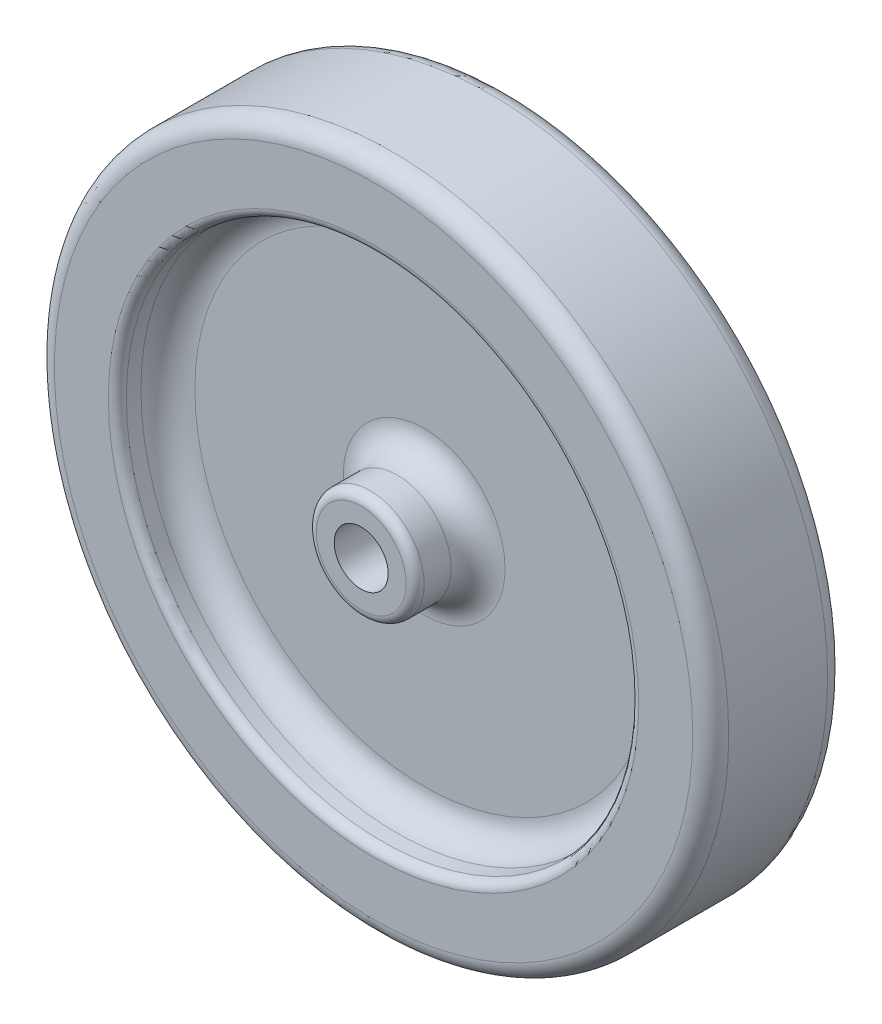
ISO-10303-21;
HEADER;
FILE_DESCRIPTION(('STEP AP214'),'2;1');
FILE_NAME('part.step','',(''),(''),'','','');
FILE_SCHEMA(('AUTOMOTIVE_DESIGN { 1 0 10303 214 1 1 1 1 }'));
ENDSEC;
DATA;
#1=APPLICATION_CONTEXT('core data for automotive mechanical design processes');
#2=APPLICATION_PROTOCOL_DEFINITION('international standard','automotive_design',2000,#1);
#3=PRODUCT_CONTEXT('',#1,'mechanical');
#4=PRODUCT('Part','Part','',(#3));
#5=PRODUCT_RELATED_PRODUCT_CATEGORY('part','',(#4));
#6=PRODUCT_DEFINITION_FORMATION('','',#4);
#7=PRODUCT_DEFINITION_CONTEXT('part definition',#1,'design');
#8=PRODUCT_DEFINITION('design','',#6,#7);
#9=PRODUCT_DEFINITION_SHAPE('','',#8);
#10=(LENGTH_UNIT() NAMED_UNIT(*) SI_UNIT(.MILLI.,.METRE.));
#11=(NAMED_UNIT(*) PLANE_ANGLE_UNIT() SI_UNIT($,.RADIAN.));
#12=(NAMED_UNIT(*) SI_UNIT($,.STERADIAN.) SOLID_ANGLE_UNIT());
#13=UNCERTAINTY_MEASURE_WITH_UNIT(LENGTH_MEASURE(1.E-05),#10,'distance_accuracy_value','');
#14=(GEOMETRIC_REPRESENTATION_CONTEXT(3) GLOBAL_UNCERTAINTY_ASSIGNED_CONTEXT((#13)) GLOBAL_UNIT_ASSIGNED_CONTEXT((#10,
#11,#12)) REPRESENTATION_CONTEXT('',''));
#15=CARTESIAN_POINT('',(0.,0.,0.));
#16=DIRECTION('',(0.,0.,1.));
#17=DIRECTION('',(1.,0.,0.));
#18=AXIS2_PLACEMENT_3D('',#15,#16,#17);
#19=CARTESIAN_POINT('',(0.,0.,10.));
#20=DIRECTION('',(0.,0.,1.));
#21=DIRECTION('',(1.,0.,0.));
#22=AXIS2_PLACEMENT_3D('',#19,#20,#21);
#23=CYLINDRICAL_SURFACE('',#22,6.);
#24=CARTESIAN_POINT('',(0.,0.,17.75));
#25=DIRECTION('',(0.,0.,1.));
#26=DIRECTION('',(1.,0.,0.));
#27=AXIS2_PLACEMENT_3D('',#24,#25,#26);
#28=CIRCLE('',#27,6.);
#29=CARTESIAN_POINT('',(6.,0.,17.75));
#30=VERTEX_POINT('',#29);
#31=EDGE_CURVE('E86',#30,#30,#28,.T.);
#32=ORIENTED_EDGE('',*,*,#31,.T.);
#33=EDGE_LOOP('',(#32));
#34=FACE_BOUND('',#33,.T.);
#35=CARTESIAN_POINT('',(0.,0.,-17.75));
#36=DIRECTION('',(0.,0.,1.));
#37=DIRECTION('',(1.,0.,0.));
#38=AXIS2_PLACEMENT_3D('',#35,#36,#37);
#39=CIRCLE('',#38,6.);
#40=CARTESIAN_POINT('',(6.,0.,-17.75));
#41=VERTEX_POINT('',#40);
#42=EDGE_CURVE('E83',#41,#41,#39,.T.);
#43=ORIENTED_EDGE('',*,*,#42,.F.);
#44=EDGE_LOOP('',(#43));
#45=FACE_BOUND('',#44,.T.);
#46=ADVANCED_FACE('F15',(#34,#45),#23,.F.);
#47=CARTESIAN_POINT('',(0.,-6.,17.75));
#48=DIRECTION('',(0.,0.,1.));
#49=DIRECTION('',(1.,0.,0.));
#50=AXIS2_PLACEMENT_3D('',#47,#48,#49);
#51=PLANE('',#50);
#52=CARTESIAN_POINT('',(0.,0.,17.75));
#53=DIRECTION('',(0.,0.,1.));
#54=DIRECTION('',(1.,0.,0.));
#55=AXIS2_PLACEMENT_3D('',#52,#53,#54);
#56=CIRCLE('',#55,10.0000003039249);
#57=CARTESIAN_POINT('',(10.0000003039249,0.,17.75));
#58=VERTEX_POINT('',#57);
#59=EDGE_CURVE('E80',#58,#58,#56,.T.);
#60=ORIENTED_EDGE('',*,*,#59,.T.);
#61=EDGE_LOOP('',(#60));
#62=FACE_BOUND('',#61,.T.);
#63=ORIENTED_EDGE('',*,*,#31,.F.);
#64=EDGE_LOOP('',(#63));
#65=FACE_BOUND('',#64,.T.);
#66=ADVANCED_FACE('F92',(#62,#65),#51,.T.);
#67=CARTESIAN_POINT('',(0.,-10.,-17.75));
#68=DIRECTION('',(0.,0.,-1.));
#69=DIRECTION('',(-1.,0.,0.));
#70=AXIS2_PLACEMENT_3D('',#67,#68,#69);
#71=PLANE('',#70);
#72=ORIENTED_EDGE('',*,*,#42,.T.);
#73=EDGE_LOOP('',(#72));
#74=FACE_BOUND('',#73,.T.);
#75=CARTESIAN_POINT('',(0.,0.,-17.75));
#76=DIRECTION('',(0.,0.,1.));
#77=DIRECTION('',(1.,0.,0.));
#78=AXIS2_PLACEMENT_3D('',#75,#76,#77);
#79=CIRCLE('',#78,10.0000003345299);
#80=CARTESIAN_POINT('',(10.0000003345299,0.,-17.75));
#81=VERTEX_POINT('',#80);
#82=EDGE_CURVE('E77',#81,#81,#79,.T.);
#83=ORIENTED_EDGE('',*,*,#82,.F.);
#84=EDGE_LOOP('',(#83));
#85=FACE_BOUND('',#84,.T.);
#86=ADVANCED_FACE('F94',(#74,#85),#71,.T.);
#87=CARTESIAN_POINT('',(0.,0.,15.7499999999997));
#88=DIRECTION('',(0.,0.,1.));
#89=DIRECTION('',(1.,0.,0.));
#90=AXIS2_PLACEMENT_3D('',#87,#88,#89);
#91=TOROIDAL_SURFACE('',#90,9.99999999999967,2.00000000000033);
#92=CARTESIAN_POINT('',(0.,0.,15.75));
#93=DIRECTION('',(0.,0.,1.));
#94=DIRECTION('',(1.,0.,0.));
#95=AXIS2_PLACEMENT_3D('',#92,#93,#94);
#96=CIRCLE('',#95,12.);
#97=CARTESIAN_POINT('',(12.,0.,15.75));
#98=VERTEX_POINT('',#97);
#99=EDGE_CURVE('E74',#98,#98,#96,.T.);
#100=ORIENTED_EDGE('',*,*,#99,.T.);
#101=EDGE_LOOP('',(#100));
#102=FACE_BOUND('',#101,.T.);
#103=ORIENTED_EDGE('',*,*,#59,.F.);
#104=EDGE_LOOP('',(#103));
#105=FACE_BOUND('',#104,.T.);
#106=ADVANCED_FACE('F102',(#102,#105),#91,.T.);
#107=CARTESIAN_POINT('',(0.,0.,-15.7499999999997));
#108=DIRECTION('',(0.,0.,1.));
#109=DIRECTION('',(1.,0.,0.));
#110=AXIS2_PLACEMENT_3D('',#107,#108,#109);
#111=TOROIDAL_SURFACE('',#110,9.99999999999967,2.00000000000033);
#112=ORIENTED_EDGE('',*,*,#82,.T.);
#113=EDGE_LOOP('',(#112));
#114=FACE_BOUND('',#113,.T.);
#115=CARTESIAN_POINT('',(0.,0.,-15.75));
#116=DIRECTION('',(0.,0.,1.));
#117=DIRECTION('',(1.,0.,0.));
#118=AXIS2_PLACEMENT_3D('',#115,#116,#117);
#119=CIRCLE('',#118,12.);
#120=CARTESIAN_POINT('',(12.,0.,-15.75));
#121=VERTEX_POINT('',#120);
#122=EDGE_CURVE('E71',#121,#121,#119,.T.);
#123=ORIENTED_EDGE('',*,*,#122,.F.);
#124=EDGE_LOOP('',(#123));
#125=FACE_BOUND('',#124,.T.);
#126=ADVANCED_FACE('F109',(#114,#125),#111,.T.);
#127=CARTESIAN_POINT('',(0.,0.,10.));
#128=DIRECTION('',(0.,0.,1.));
#129=DIRECTION('',(1.,0.,0.));
#130=AXIS2_PLACEMENT_3D('',#127,#128,#129);
#131=CYLINDRICAL_SURFACE('',#130,12.);
#132=CARTESIAN_POINT('',(0.,0.,9.75));
#133=DIRECTION('',(0.,0.,1.));
#134=DIRECTION('',(1.,0.,0.));
#135=AXIS2_PLACEMENT_3D('',#132,#133,#134);
#136=CIRCLE('',#135,12.);
#137=CARTESIAN_POINT('',(12.,0.,9.75));
#138=VERTEX_POINT('',#137);
#139=EDGE_CURVE('E68',#138,#138,#136,.T.);
#140=ORIENTED_EDGE('',*,*,#139,.T.);
#141=EDGE_LOOP('',(#140));
#142=FACE_BOUND('',#141,.T.);
#143=ORIENTED_EDGE('',*,*,#99,.F.);
#144=EDGE_LOOP('',(#143));
#145=FACE_BOUND('',#144,.T.);
#146=ADVANCED_FACE('F113',(#142,#145),#131,.T.);
#147=CARTESIAN_POINT('',(0.,0.,10.));
#148=DIRECTION('',(0.,0.,1.));
#149=DIRECTION('',(1.,0.,0.));
#150=AXIS2_PLACEMENT_3D('',#147,#148,#149);
#151=CYLINDRICAL_SURFACE('',#150,12.);
#152=ORIENTED_EDGE('',*,*,#122,.T.);
#153=EDGE_LOOP('',(#152));
#154=FACE_BOUND('',#153,.T.);
#155=CARTESIAN_POINT('',(0.,0.,-9.75));
#156=DIRECTION('',(0.,0.,1.));
#157=DIRECTION('',(1.,0.,0.));
#158=AXIS2_PLACEMENT_3D('',#155,#156,#157);
#159=CIRCLE('',#158,12.);
#160=CARTESIAN_POINT('',(12.,0.,-9.75));
#161=VERTEX_POINT('',#160);
#162=EDGE_CURVE('E65',#161,#161,#159,.T.);
#163=ORIENTED_EDGE('',*,*,#162,.F.);
#164=EDGE_LOOP('',(#163));
#165=FACE_BOUND('',#164,.T.);
#166=ADVANCED_FACE('F117',(#154,#165),#151,.T.);
#167=CARTESIAN_POINT('',(0.,0.,9.75000000000046));
#168=DIRECTION('',(0.,0.,1.));
#169=DIRECTION('',(1.,0.,0.));
#170=AXIS2_PLACEMENT_3D('',#167,#168,#169);
#171=TOROIDAL_SURFACE('',#170,18.0000000000005,6.00000000000046);
#172=ORIENTED_EDGE('',*,*,#139,.F.);
#173=EDGE_LOOP('',(#172));
#174=FACE_BOUND('',#173,.T.);
#175=CARTESIAN_POINT('',(0.,0.,3.75));
#176=DIRECTION('',(0.,0.,1.));
#177=DIRECTION('',(1.,0.,0.));
#178=AXIS2_PLACEMENT_3D('',#175,#176,#177);
#179=CIRCLE('',#178,18.0000000000005);
#180=CARTESIAN_POINT('',(18.0000000000005,0.,3.75));
#181=VERTEX_POINT('',#180);
#182=EDGE_CURVE('E62',#181,#181,#179,.T.);
#183=ORIENTED_EDGE('',*,*,#182,.T.);
#184=EDGE_LOOP('',(#183));
#185=FACE_BOUND('',#184,.T.);
#186=ADVANCED_FACE('F121',(#174,#185),#171,.F.);
#187=CARTESIAN_POINT('',(0.,0.,-9.75000000000046));
#188=DIRECTION('',(0.,0.,1.));
#189=DIRECTION('',(1.,0.,0.));
#190=AXIS2_PLACEMENT_3D('',#187,#188,#189);
#191=TOROIDAL_SURFACE('',#190,18.0000000000005,6.00000000000046);
#192=CARTESIAN_POINT('',(0.,0.,-3.75));
#193=DIRECTION('',(0.,0.,1.));
#194=DIRECTION('',(1.,0.,0.));
#195=AXIS2_PLACEMENT_3D('',#192,#193,#194);
#196=CIRCLE('',#195,18.0000000000005);
#197=CARTESIAN_POINT('',(18.0000000000005,0.,-3.75));
#198=VERTEX_POINT('',#197);
#199=EDGE_CURVE('E59',#198,#198,#196,.T.);
#200=ORIENTED_EDGE('',*,*,#199,.F.);
#201=EDGE_LOOP('',(#200));
#202=FACE_BOUND('',#201,.T.);
#203=ORIENTED_EDGE('',*,*,#162,.T.);
#204=EDGE_LOOP('',(#203));
#205=FACE_BOUND('',#204,.T.);
#206=ADVANCED_FACE('F125',(#202,#205),#191,.F.);
#207=CARTESIAN_POINT('',(0.,-18.,3.75));
#208=DIRECTION('',(0.,0.,1.));
#209=DIRECTION('',(1.,0.,0.));
#210=AXIS2_PLACEMENT_3D('',#207,#208,#209);
#211=PLANE('',#210);
#212=CARTESIAN_POINT('',(0.,0.,3.75));
#213=DIRECTION('',(0.,0.,1.));
#214=DIRECTION('',(1.,0.,0.));
#215=AXIS2_PLACEMENT_3D('',#212,#213,#214);
#216=CIRCLE('',#215,51.);
#217=CARTESIAN_POINT('',(51.,0.,3.75));
#218=VERTEX_POINT('',#217);
#219=EDGE_CURVE('E56',#218,#218,#216,.T.);
#220=ORIENTED_EDGE('',*,*,#219,.T.);
#221=EDGE_LOOP('',(#220));
#222=FACE_BOUND('',#221,.T.);
#223=ORIENTED_EDGE('',*,*,#182,.F.);
#224=EDGE_LOOP('',(#223));
#225=FACE_BOUND('',#224,.T.);
#226=ADVANCED_FACE('F129',(#222,#225),#211,.T.);
#227=CARTESIAN_POINT('',(0.,-51.,-3.75));
#228=DIRECTION('',(0.,0.,-1.));
#229=DIRECTION('',(-1.,0.,0.));
#230=AXIS2_PLACEMENT_3D('',#227,#228,#229);
#231=PLANE('',#230);
#232=ORIENTED_EDGE('',*,*,#199,.T.);
#233=EDGE_LOOP('',(#232));
#234=FACE_BOUND('',#233,.T.);
#235=CARTESIAN_POINT('',(0.,0.,-3.75));
#236=DIRECTION('',(0.,0.,1.));
#237=DIRECTION('',(1.,0.,0.));
#238=AXIS2_PLACEMENT_3D('',#235,#236,#237);
#239=CIRCLE('',#238,51.);
#240=CARTESIAN_POINT('',(51.,0.,-3.75));
#241=VERTEX_POINT('',#240);
#242=EDGE_CURVE('E53',#241,#241,#239,.T.);
#243=ORIENTED_EDGE('',*,*,#242,.F.);
#244=EDGE_LOOP('',(#243));
#245=FACE_BOUND('',#244,.T.);
#246=ADVANCED_FACE('F133',(#234,#245),#231,.T.);
#247=CARTESIAN_POINT('',(0.,0.,9.75000000000046));
#248=DIRECTION('',(0.,0.,1.));
#249=DIRECTION('',(1.,0.,0.));
#250=AXIS2_PLACEMENT_3D('',#247,#248,#249);
#251=TOROIDAL_SURFACE('',#250,51.,6.00000000000046);
#252=ORIENTED_EDGE('',*,*,#219,.F.);
#253=EDGE_LOOP('',(#252));
#254=FACE_BOUND('',#253,.T.);
#255=CARTESIAN_POINT('',(0.,0.,9.75));
#256=DIRECTION('',(0.,0.,1.));
#257=DIRECTION('',(1.,0.,0.));
#258=AXIS2_PLACEMENT_3D('',#255,#256,#257);
#259=CIRCLE('',#258,57.);
#260=CARTESIAN_POINT('',(57.,0.,9.75));
#261=VERTEX_POINT('',#260);
#262=EDGE_CURVE('E50',#261,#261,#259,.T.);
#263=ORIENTED_EDGE('',*,*,#262,.T.);
#264=EDGE_LOOP('',(#263));
#265=FACE_BOUND('',#264,.T.);
#266=ADVANCED_FACE('F137',(#254,#265),#251,.F.);
#267=CARTESIAN_POINT('',(0.,0.,-9.75000000000046));
#268=DIRECTION('',(0.,0.,1.));
#269=DIRECTION('',(1.,0.,0.));
#270=AXIS2_PLACEMENT_3D('',#267,#268,#269);
#271=TOROIDAL_SURFACE('',#270,51.,6.00000000000046);
#272=CARTESIAN_POINT('',(0.,0.,-9.75));
#273=DIRECTION('',(0.,0.,1.));
#274=DIRECTION('',(1.,0.,0.));
#275=AXIS2_PLACEMENT_3D('',#272,#273,#274);
#276=CIRCLE('',#275,57.);
#277=CARTESIAN_POINT('',(57.,0.,-9.75));
#278=VERTEX_POINT('',#277);
#279=EDGE_CURVE('E47',#278,#278,#276,.T.);
#280=ORIENTED_EDGE('',*,*,#279,.F.);
#281=EDGE_LOOP('',(#280));
#282=FACE_BOUND('',#281,.T.);
#283=ORIENTED_EDGE('',*,*,#242,.T.);
#284=EDGE_LOOP('',(#283));
#285=FACE_BOUND('',#284,.T.);
#286=ADVANCED_FACE('F141',(#282,#285),#271,.F.);
#287=CARTESIAN_POINT('',(0.,0.,10.));
#288=DIRECTION('',(0.,0.,1.));
#289=DIRECTION('',(1.,0.,0.));
#290=AXIS2_PLACEMENT_3D('',#287,#288,#289);
#291=CYLINDRICAL_SURFACE('',#290,57.);
#292=CARTESIAN_POINT('',(0.,0.,13.));
#293=DIRECTION('',(0.,0.,1.));
#294=DIRECTION('',(1.,0.,0.));
#295=AXIS2_PLACEMENT_3D('',#292,#293,#294);
#296=CIRCLE('',#295,57.);
#297=CARTESIAN_POINT('',(57.,0.,13.));
#298=VERTEX_POINT('',#297);
#299=EDGE_CURVE('E44',#298,#298,#296,.T.);
#300=ORIENTED_EDGE('',*,*,#299,.T.);
#301=EDGE_LOOP('',(#300));
#302=FACE_BOUND('',#301,.T.);
#303=ORIENTED_EDGE('',*,*,#262,.F.);
#304=EDGE_LOOP('',(#303));
#305=FACE_BOUND('',#304,.T.);
#306=ADVANCED_FACE('F145',(#302,#305),#291,.F.);
#307=CARTESIAN_POINT('',(0.,0.,10.));
#308=DIRECTION('',(0.,0.,1.));
#309=DIRECTION('',(1.,0.,0.));
#310=AXIS2_PLACEMENT_3D('',#307,#308,#309);
#311=CYLINDRICAL_SURFACE('',#310,57.);
#312=ORIENTED_EDGE('',*,*,#279,.T.);
#313=EDGE_LOOP('',(#312));
#314=FACE_BOUND('',#313,.T.);
#315=CARTESIAN_POINT('',(0.,0.,-13.));
#316=DIRECTION('',(0.,0.,1.));
#317=DIRECTION('',(1.,0.,0.));
#318=AXIS2_PLACEMENT_3D('',#315,#316,#317);
#319=CIRCLE('',#318,57.);
#320=CARTESIAN_POINT('',(57.,0.,-13.));
#321=VERTEX_POINT('',#320);
#322=EDGE_CURVE('E41',#321,#321,#319,.T.);
#323=ORIENTED_EDGE('',*,*,#322,.F.);
#324=EDGE_LOOP('',(#323));
#325=FACE_BOUND('',#324,.T.);
#326=ADVANCED_FACE('F149',(#314,#325),#311,.F.);
#327=CARTESIAN_POINT('',(0.,0.,12.9999999999997));
#328=DIRECTION('',(0.,0.,1.));
#329=DIRECTION('',(1.,0.,0.));
#330=AXIS2_PLACEMENT_3D('',#327,#328,#329);
#331=TOROIDAL_SURFACE('',#330,59.,2.00000000000032);
#332=CARTESIAN_POINT('',(0.,0.,15.));
#333=DIRECTION('',(0.,0.,1.));
#334=DIRECTION('',(1.,0.,0.));
#335=AXIS2_PLACEMENT_3D('',#332,#333,#334);
#336=CIRCLE('',#335,58.9999999578531);
#337=CARTESIAN_POINT('',(58.9999999578531,0.,15.));
#338=VERTEX_POINT('',#337);
#339=EDGE_CURVE('E38',#338,#338,#336,.T.);
#340=ORIENTED_EDGE('',*,*,#339,.T.);
#341=EDGE_LOOP('',(#340));
#342=FACE_BOUND('',#341,.T.);
#343=ORIENTED_EDGE('',*,*,#299,.F.);
#344=EDGE_LOOP('',(#343));
#345=FACE_BOUND('',#344,.T.);
#346=ADVANCED_FACE('F153',(#342,#345),#331,.T.);
#347=CARTESIAN_POINT('',(0.,0.,-12.9999999999997));
#348=DIRECTION('',(0.,0.,1.));
#349=DIRECTION('',(1.,0.,0.));
#350=AXIS2_PLACEMENT_3D('',#347,#348,#349);
#351=TOROIDAL_SURFACE('',#350,59.,2.00000000000033);
#352=ORIENTED_EDGE('',*,*,#322,.T.);
#353=EDGE_LOOP('',(#352));
#354=FACE_BOUND('',#353,.T.);
#355=CARTESIAN_POINT('',(0.,0.,-15.));
#356=DIRECTION('',(0.,0.,1.));
#357=DIRECTION('',(1.,0.,0.));
#358=AXIS2_PLACEMENT_3D('',#355,#356,#357);
#359=CIRCLE('',#358,58.999999853999);
#360=CARTESIAN_POINT('',(58.999999853999,0.,-15.));
#361=VERTEX_POINT('',#360);
#362=EDGE_CURVE('E35',#361,#361,#359,.T.);
#363=ORIENTED_EDGE('',*,*,#362,.F.);
#364=EDGE_LOOP('',(#363));
#365=FACE_BOUND('',#364,.T.);
#366=ADVANCED_FACE('F157',(#354,#365),#351,.T.);
#367=CARTESIAN_POINT('',(0.,-59.,15.));
#368=DIRECTION('',(0.,0.,1.));
#369=DIRECTION('',(1.,0.,0.));
#370=AXIS2_PLACEMENT_3D('',#367,#368,#369);
#371=PLANE('',#370);
#372=CARTESIAN_POINT('',(0.,0.,15.));
#373=DIRECTION('',(0.,0.,1.));
#374=DIRECTION('',(1.,0.,0.));
#375=AXIS2_PLACEMENT_3D('',#372,#373,#374);
#376=CIRCLE('',#375,71.0000031438248);
#377=CARTESIAN_POINT('',(71.0000031438248,0.,15.));
#378=VERTEX_POINT('',#377);
#379=EDGE_CURVE('E30',#378,#378,#376,.T.);
#380=ORIENTED_EDGE('',*,*,#379,.T.);
#381=EDGE_LOOP('',(#380));
#382=FACE_BOUND('',#381,.T.);
#383=ORIENTED_EDGE('',*,*,#339,.F.);
#384=EDGE_LOOP('',(#383));
#385=FACE_BOUND('',#384,.T.);
#386=ADVANCED_FACE('F161',(#382,#385),#371,.T.);
#387=CARTESIAN_POINT('',(0.,-71.,-15.));
#388=DIRECTION('',(0.,0.,-1.));
#389=DIRECTION('',(-1.,0.,0.));
#390=AXIS2_PLACEMENT_3D('',#387,#388,#389);
#391=PLANE('',#390);
#392=ORIENTED_EDGE('',*,*,#362,.T.);
#393=EDGE_LOOP('',(#392));
#394=FACE_BOUND('',#393,.T.);
#395=CARTESIAN_POINT('',(0.,0.,-15.));
#396=DIRECTION('',(0.,0.,1.));
#397=DIRECTION('',(1.,0.,0.));
#398=AXIS2_PLACEMENT_3D('',#395,#396,#397);
#399=CIRCLE('',#398,71.);
#400=CARTESIAN_POINT('',(71.,0.,-15.));
#401=VERTEX_POINT('',#400);
#402=EDGE_CURVE('E26',#401,#401,#399,.T.);
#403=ORIENTED_EDGE('',*,*,#402,.F.);
#404=EDGE_LOOP('',(#403));
#405=FACE_BOUND('',#404,.T.);
#406=ADVANCED_FACE('F165',(#394,#405),#391,.T.);
#407=CARTESIAN_POINT('',(0.,0.,10.9999999999988));
#408=DIRECTION('',(0.,0.,1.));
#409=DIRECTION('',(1.,0.,0.));
#410=AXIS2_PLACEMENT_3D('',#407,#408,#409);
#411=TOROIDAL_SURFACE('',#410,70.9999999999976,4.00000000000243);
#412=CARTESIAN_POINT('',(0.,0.,11.));
#413=DIRECTION('',(0.,0.,1.));
#414=DIRECTION('',(1.,0.,0.));
#415=AXIS2_PLACEMENT_3D('',#412,#413,#414);
#416=CIRCLE('',#415,75.);
#417=CARTESIAN_POINT('',(75.,0.,11.));
#418=VERTEX_POINT('',#417);
#419=EDGE_CURVE('E22',#418,#418,#416,.T.);
#420=ORIENTED_EDGE('',*,*,#419,.T.);
#421=EDGE_LOOP('',(#420));
#422=FACE_BOUND('',#421,.T.);
#423=ORIENTED_EDGE('',*,*,#379,.F.);
#424=EDGE_LOOP('',(#423));
#425=FACE_BOUND('',#424,.T.);
#426=ADVANCED_FACE('F169',(#422,#425),#411,.T.);
#427=CARTESIAN_POINT('',(0.,0.,-10.9999999999994));
#428=DIRECTION('',(0.,0.,1.));
#429=DIRECTION('',(1.,0.,0.));
#430=AXIS2_PLACEMENT_3D('',#427,#428,#429);
#431=TOROIDAL_SURFACE('',#430,71.,4.00000000000063);
#432=ORIENTED_EDGE('',*,*,#402,.T.);
#433=EDGE_LOOP('',(#432));
#434=FACE_BOUND('',#433,.T.);
#435=CARTESIAN_POINT('',(0.,0.,-11.));
#436=DIRECTION('',(0.,0.,1.));
#437=DIRECTION('',(1.,0.,0.));
#438=AXIS2_PLACEMENT_3D('',#435,#436,#437);
#439=CIRCLE('',#438,75.);
#440=CARTESIAN_POINT('',(75.,0.,-11.));
#441=VERTEX_POINT('',#440);
#442=EDGE_CURVE('E10',#441,#441,#439,.T.);
#443=ORIENTED_EDGE('',*,*,#442,.F.);
#444=EDGE_LOOP('',(#443));
#445=FACE_BOUND('',#444,.T.);
#446=ADVANCED_FACE('F172',(#434,#445),#431,.T.);
#447=CARTESIAN_POINT('',(0.,0.,10.));
#448=DIRECTION('',(0.,0.,1.));
#449=DIRECTION('',(1.,0.,0.));
#450=AXIS2_PLACEMENT_3D('',#447,#448,#449);
#451=CYLINDRICAL_SURFACE('',#450,75.);
#452=ORIENTED_EDGE('',*,*,#442,.T.);
#453=EDGE_LOOP('',(#452));
#454=FACE_BOUND('',#453,.T.);
#455=ORIENTED_EDGE('',*,*,#419,.F.);
#456=EDGE_LOOP('',(#455));
#457=FACE_BOUND('',#456,.T.);
#458=ADVANCED_FACE('F17',(#454,#457),#451,.T.);
#459=CLOSED_SHELL('',(#46,#66,#86,#106,#126,#146,#166,#186,#206,#226,#246,#266,#286,#306,#326,
#346,#366,#386,#406,#426,#446,#458));
#460=MANIFOLD_SOLID_BREP('B1',#459);
#461=ADVANCED_BREP_SHAPE_REPRESENTATION('',(#18,#460),#14);
#462=SHAPE_DEFINITION_REPRESENTATION(#9,#461);
ENDSEC;
END-ISO-10303-21;
